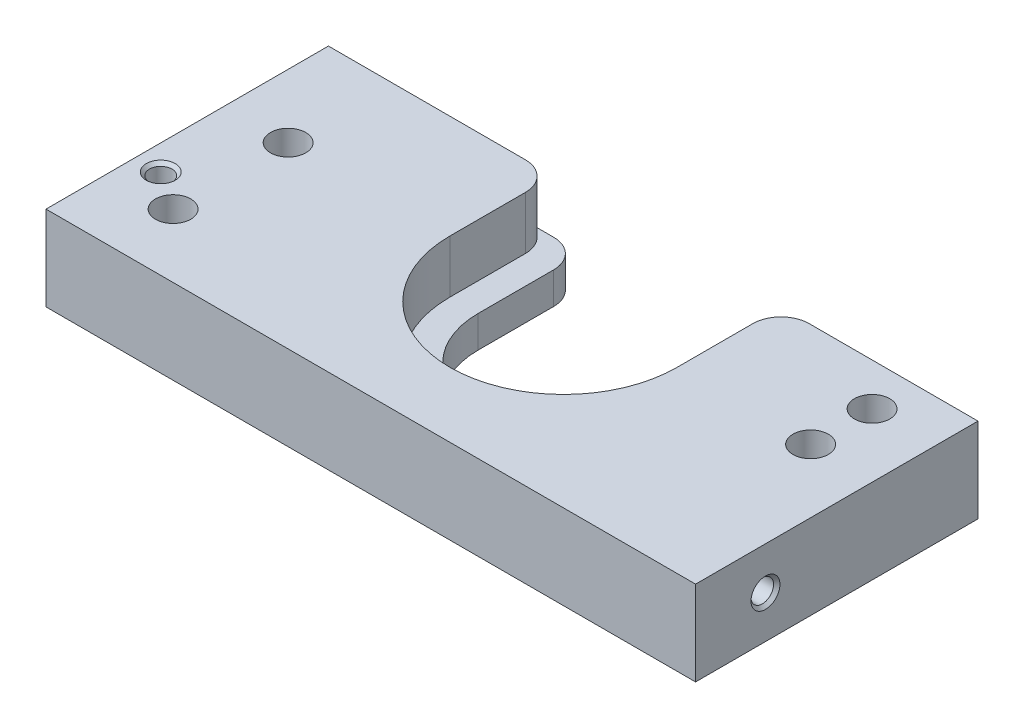
ISO-10303-21;
HEADER;
FILE_DESCRIPTION(('STEP AP214'),'2;1');
FILE_NAME('part.step','',(''),(''),'','','');
FILE_SCHEMA(('AUTOMOTIVE_DESIGN { 1 0 10303 214 1 1 1 1 }'));
ENDSEC;
DATA;
#1=APPLICATION_CONTEXT('core data for automotive mechanical design processes');
#2=APPLICATION_PROTOCOL_DEFINITION('international standard','automotive_design',2000,#1);
#3=PRODUCT_CONTEXT('',#1,'mechanical');
#4=PRODUCT('Part','Part','',(#3));
#5=PRODUCT_RELATED_PRODUCT_CATEGORY('part','',(#4));
#6=PRODUCT_DEFINITION_FORMATION('','',#4);
#7=PRODUCT_DEFINITION_CONTEXT('part definition',#1,'design');
#8=PRODUCT_DEFINITION('design','',#6,#7);
#9=PRODUCT_DEFINITION_SHAPE('','',#8);
#10=(LENGTH_UNIT() NAMED_UNIT(*) SI_UNIT(.MILLI.,.METRE.));
#11=(NAMED_UNIT(*) PLANE_ANGLE_UNIT() SI_UNIT($,.RADIAN.));
#12=(NAMED_UNIT(*) SI_UNIT($,.STERADIAN.) SOLID_ANGLE_UNIT());
#13=UNCERTAINTY_MEASURE_WITH_UNIT(LENGTH_MEASURE(1.E-05),#10,'distance_accuracy_value','');
#14=(GEOMETRIC_REPRESENTATION_CONTEXT(3) GLOBAL_UNCERTAINTY_ASSIGNED_CONTEXT((#13)) GLOBAL_UNIT_ASSIGNED_CONTEXT((#10,
#11,#12)) REPRESENTATION_CONTEXT('',''));
#15=CARTESIAN_POINT('',(0.,0.,0.));
#16=DIRECTION('',(0.,0.,1.));
#17=DIRECTION('',(1.,0.,0.));
#18=AXIS2_PLACEMENT_3D('',#15,#16,#17);
#19=CARTESIAN_POINT('',(8.05,6.,-5.35282576347172));
#20=DIRECTION('',(0.,-1.,0.));
#21=DIRECTION('',(0.,0.,-1.));
#22=AXIS2_PLACEMENT_3D('',#19,#20,#21);
#23=CYLINDRICAL_SURFACE('',#22,2.);
#24=CARTESIAN_POINT('',(8.05,2.25,-5.35282576347172));
#25=DIRECTION('',(0.,1.,0.));
#26=DIRECTION('',(0.,0.,1.));
#27=AXIS2_PLACEMENT_3D('',#24,#25,#26);
#28=CIRCLE('',#27,2.);
#29=CARTESIAN_POINT('',(8.05,2.25,-7.35282576347173));
#30=VERTEX_POINT('',#29);
#31=CARTESIAN_POINT('',(6.05,2.25,-5.35282576347172));
#32=VERTEX_POINT('',#31);
#33=EDGE_CURVE('E273',#30,#32,#28,.T.);
#34=ORIENTED_EDGE('',*,*,#33,.F.);
#35=DIRECTION('',(0.,-1.,0.));
#36=VECTOR('',#35,1.);
#37=CARTESIAN_POINT('',(8.05,6.,-7.35282576347172));
#38=LINE('',#37,#36);
#39=CARTESIAN_POINT('',(8.05,0.,-7.35282576347172));
#40=VERTEX_POINT('',#39);
#41=EDGE_CURVE('E109',#30,#40,#38,.T.);
#42=ORIENTED_EDGE('',*,*,#41,.T.);
#43=CARTESIAN_POINT('',(8.05,0.,-5.35282576347172));
#44=DIRECTION('',(0.,1.,0.));
#45=DIRECTION('',(0.,0.,1.));
#46=AXIS2_PLACEMENT_3D('',#43,#44,#45);
#47=CIRCLE('',#46,2.);
#48=CARTESIAN_POINT('',(6.05,0.,-5.35282576347172));
#49=VERTEX_POINT('',#48);
#50=EDGE_CURVE('E299',#40,#49,#47,.T.);
#51=ORIENTED_EDGE('',*,*,#50,.T.);
#52=DIRECTION('',(0.,-1.,0.));
#53=VECTOR('',#52,1.);
#54=CARTESIAN_POINT('',(6.05,6.,-5.35282576347172));
#55=LINE('',#54,#53);
#56=EDGE_CURVE('E11',#32,#49,#55,.T.);
#57=ORIENTED_EDGE('',*,*,#56,.F.);
#58=EDGE_LOOP('',(#34,#42,#51,#57));
#59=FACE_BOUND('',#58,.T.);
#60=ADVANCED_FACE('F43',(#59),#23,.T.);
#61=CARTESIAN_POINT('',(6.05,6.,-5.35282576347172));
#62=DIRECTION('',(1.,0.,0.));
#63=DIRECTION('',(0.,0.,-1.));
#64=AXIS2_PLACEMENT_3D('',#61,#62,#63);
#65=PLANE('',#64);
#66=DIRECTION('',(0.,0.,1.));
#67=VECTOR('',#66,1.);
#68=CARTESIAN_POINT('',(6.05,2.25,-5.35282576347172));
#69=LINE('',#68,#67);
#70=CARTESIAN_POINT('',(6.05,2.25,0.));
#71=VERTEX_POINT('',#70);
#72=EDGE_CURVE('E271',#32,#71,#69,.T.);
#73=ORIENTED_EDGE('',*,*,#72,.F.);
#74=ORIENTED_EDGE('',*,*,#56,.T.);
#75=DIRECTION('',(0.,0.,1.));
#76=VECTOR('',#75,1.);
#77=CARTESIAN_POINT('',(6.05,0.,-5.35282576347172));
#78=LINE('',#77,#76);
#79=CARTESIAN_POINT('',(6.05,0.,0.));
#80=VERTEX_POINT('',#79);
#81=EDGE_CURVE('E313',#49,#80,#78,.T.);
#82=ORIENTED_EDGE('',*,*,#81,.T.);
#83=DIRECTION('',(0.,-1.,0.));
#84=VECTOR('',#83,1.);
#85=CARTESIAN_POINT('',(6.05,6.,0.));
#86=LINE('',#85,#84);
#87=EDGE_CURVE('E50',#71,#80,#86,.T.);
#88=ORIENTED_EDGE('',*,*,#87,.F.);
#89=EDGE_LOOP('',(#73,#74,#82,#88));
#90=FACE_BOUND('',#89,.T.);
#91=ADVANCED_FACE('F372',(#90),#65,.F.);
#92=CARTESIAN_POINT('',(0.,6.,0.));
#93=DIRECTION('',(0.,-1.,0.));
#94=DIRECTION('',(0.,0.,-1.));
#95=AXIS2_PLACEMENT_3D('',#92,#93,#94);
#96=CYLINDRICAL_SURFACE('',#95,6.05);
#97=CARTESIAN_POINT('',(0.,2.25,0.));
#98=DIRECTION('',(0.,1.,0.));
#99=DIRECTION('',(0.,0.,1.));
#100=AXIS2_PLACEMENT_3D('',#97,#98,#99);
#101=CIRCLE('',#100,6.05);
#102=CARTESIAN_POINT('',(-6.05,2.25,0.));
#103=VERTEX_POINT('',#102);
#104=EDGE_CURVE('E268',#71,#103,#101,.F.);
#105=ORIENTED_EDGE('',*,*,#104,.F.);
#106=ORIENTED_EDGE('',*,*,#87,.T.);
#107=CARTESIAN_POINT('',(0.,0.,0.));
#108=DIRECTION('',(0.,-1.,0.));
#109=DIRECTION('',(0.,0.,-1.));
#110=AXIS2_PLACEMENT_3D('',#107,#108,#109);
#111=CIRCLE('',#110,6.05);
#112=CARTESIAN_POINT('',(-6.05,0.,0.));
#113=VERTEX_POINT('',#112);
#114=EDGE_CURVE('E316',#80,#113,#111,.T.);
#115=ORIENTED_EDGE('',*,*,#114,.T.);
#116=DIRECTION('',(0.,-1.,0.));
#117=VECTOR('',#116,1.);
#118=CARTESIAN_POINT('',(-6.05,6.,0.));
#119=LINE('',#118,#117);
#120=EDGE_CURVE('E360',#103,#113,#119,.T.);
#121=ORIENTED_EDGE('',*,*,#120,.F.);
#122=EDGE_LOOP('',(#105,#106,#115,#121));
#123=FACE_BOUND('',#122,.T.);
#124=ADVANCED_FACE('F365',(#123),#96,.F.);
#125=CARTESIAN_POINT('',(-6.05,6.,0.));
#126=DIRECTION('',(-1.,0.,0.));
#127=DIRECTION('',(0.,0.,1.));
#128=AXIS2_PLACEMENT_3D('',#125,#126,#127);
#129=PLANE('',#128);
#130=DIRECTION('',(0.,0.,-1.));
#131=VECTOR('',#130,1.);
#132=CARTESIAN_POINT('',(-6.05,2.25,0.));
#133=LINE('',#132,#131);
#134=CARTESIAN_POINT('',(-6.05,2.25,-5.35282576347172));
#135=VERTEX_POINT('',#134);
#136=EDGE_CURVE('E265',#103,#135,#133,.T.);
#137=ORIENTED_EDGE('',*,*,#136,.F.);
#138=ORIENTED_EDGE('',*,*,#120,.T.);
#139=DIRECTION('',(0.,0.,-1.));
#140=VECTOR('',#139,1.);
#141=CARTESIAN_POINT('',(-6.05,0.,0.));
#142=LINE('',#141,#140);
#143=CARTESIAN_POINT('',(-6.05,0.,-5.35282576347172));
#144=VERTEX_POINT('',#143);
#145=EDGE_CURVE('E320',#113,#144,#142,.T.);
#146=ORIENTED_EDGE('',*,*,#145,.T.);
#147=DIRECTION('',(0.,-1.,0.));
#148=VECTOR('',#147,1.);
#149=CARTESIAN_POINT('',(-6.05,6.,-5.35282576347172));
#150=LINE('',#149,#148);
#151=EDGE_CURVE('E357',#135,#144,#150,.T.);
#152=ORIENTED_EDGE('',*,*,#151,.F.);
#153=EDGE_LOOP('',(#137,#138,#146,#152));
#154=FACE_BOUND('',#153,.T.);
#155=ADVANCED_FACE('F383',(#154),#129,.F.);
#156=CARTESIAN_POINT('',(-8.05,6.,-5.35282576347172));
#157=DIRECTION('',(0.,-1.,0.));
#158=DIRECTION('',(0.,0.,-1.));
#159=AXIS2_PLACEMENT_3D('',#156,#157,#158);
#160=CYLINDRICAL_SURFACE('',#159,2.);
#161=CARTESIAN_POINT('',(-8.05,2.25,-5.35282576347172));
#162=DIRECTION('',(0.,1.,0.));
#163=DIRECTION('',(0.,0.,1.));
#164=AXIS2_PLACEMENT_3D('',#161,#162,#163);
#165=CIRCLE('',#164,2.);
#166=CARTESIAN_POINT('',(-8.05,2.25,-7.35282576347172));
#167=VERTEX_POINT('',#166);
#168=EDGE_CURVE('E250',#135,#167,#165,.T.);
#169=ORIENTED_EDGE('',*,*,#168,.F.);
#170=ORIENTED_EDGE('',*,*,#151,.T.);
#171=CARTESIAN_POINT('',(-8.05,0.,-5.35282576347172));
#172=DIRECTION('',(0.,1.,0.));
#173=DIRECTION('',(0.,0.,1.));
#174=AXIS2_PLACEMENT_3D('',#171,#172,#173);
#175=CIRCLE('',#174,2.);
#176=CARTESIAN_POINT('',(-8.05,0.,-7.35282576347172));
#177=VERTEX_POINT('',#176);
#178=EDGE_CURVE('E324',#144,#177,#175,.T.);
#179=ORIENTED_EDGE('',*,*,#178,.T.);
#180=DIRECTION('',(0.,-1.,0.));
#181=VECTOR('',#180,1.);
#182=CARTESIAN_POINT('',(-8.05,6.,-7.35282576347172));
#183=LINE('',#182,#181);
#184=EDGE_CURVE('E354',#167,#177,#183,.T.);
#185=ORIENTED_EDGE('',*,*,#184,.F.);
#186=EDGE_LOOP('',(#169,#170,#179,#185));
#187=FACE_BOUND('',#186,.T.);
#188=ADVANCED_FACE('F389',(#187),#160,.T.);
#189=CARTESIAN_POINT('',(8.05,6.,-7.35282576347172));
#190=DIRECTION('',(0.,0.,1.));
#191=DIRECTION('',(1.,0.,0.));
#192=AXIS2_PLACEMENT_3D('',#189,#190,#191);
#193=PLANE('',#192);
#194=DIRECTION('',(0.,1.,0.));
#195=VECTOR('',#194,1.);
#196=CARTESIAN_POINT('',(10.05,2.25,-7.35282576347173));
#197=LINE('',#196,#195);
#198=CARTESIAN_POINT('',(10.05,2.25,-7.35282576347172));
#199=VERTEX_POINT('',#198);
#200=CARTESIAN_POINT('',(10.05,6.,-7.35282576347173));
#201=VERTEX_POINT('',#200);
#202=EDGE_CURVE('E257',#199,#201,#197,.T.);
#203=ORIENTED_EDGE('',*,*,#202,.T.);
#204=DIRECTION('',(-1.,0.,0.));
#205=VECTOR('',#204,1.);
#206=CARTESIAN_POINT('',(8.05,6.,-7.35282576347172));
#207=LINE('',#206,#205);
#208=CARTESIAN_POINT('',(22.0000000002517,6.,-7.35282576347172));
#209=VERTEX_POINT('',#208);
#210=EDGE_CURVE('E310',#209,#201,#207,.T.);
#211=ORIENTED_EDGE('',*,*,#210,.F.);
#212=DIRECTION('',(0.,-1.,0.));
#213=VECTOR('',#212,1.);
#214=CARTESIAN_POINT('',(22.0000000002517,6.,-7.35282576347172));
#215=LINE('',#214,#213);
#216=CARTESIAN_POINT('',(22.0000000002517,0.,-7.35282576347172));
#217=VERTEX_POINT('',#216);
#218=EDGE_CURVE('E341',#209,#217,#215,.T.);
#219=ORIENTED_EDGE('',*,*,#218,.T.);
#220=DIRECTION('',(-1.,0.,0.));
#221=VECTOR('',#220,1.);
#222=CARTESIAN_POINT('',(8.05,0.,-7.35282576347172));
#223=LINE('',#222,#221);
#224=EDGE_CURVE('E304',#217,#40,#223,.T.);
#225=ORIENTED_EDGE('',*,*,#224,.T.);
#226=ORIENTED_EDGE('',*,*,#41,.F.);
#227=DIRECTION('',(-1.,0.,0.));
#228=VECTOR('',#227,1.);
#229=CARTESIAN_POINT('',(-10.05,2.25,-7.35282576347172));
#230=LINE('',#229,#228);
#231=EDGE_CURVE('E222',#199,#30,#230,.T.);
#232=ORIENTED_EDGE('',*,*,#231,.F.);
#233=EDGE_LOOP('',(#203,#211,#219,#225,#226,#232));
#234=FACE_BOUND('',#233,.T.);
#235=ADVANCED_FACE('F415',(#234),#193,.F.);
#236=CARTESIAN_POINT('',(8.05,6.,-5.35282576347172));
#237=DIRECTION('',(0.,1.,0.));
#238=DIRECTION('',(0.,0.,1.));
#239=AXIS2_PLACEMENT_3D('',#236,#237,#238);
#240=PLANE('',#239);
#241=CARTESIAN_POINT('',(-22.2169543155455,6.,6.3042015797983));
#242=DIRECTION('',(0.,1.,0.));
#243=DIRECTION('',(0.,0.,1.));
#244=AXIS2_PLACEMENT_3D('',#241,#242,#243);
#245=CIRCLE('',#244,1.025);
#246=CARTESIAN_POINT('',(-22.2169543155455,6.,7.32920157979829));
#247=VERTEX_POINT('',#246);
#248=EDGE_CURVE('E748',#247,#247,#245,.T.);
#249=ORIENTED_EDGE('',*,*,#248,.F.);
#250=EDGE_LOOP('',(#249));
#251=FACE_BOUND('',#250,.T.);
#252=CARTESIAN_POINT('',(-10.05,6.,-5.35282576347172));
#253=DIRECTION('',(0.,-1.,0.));
#254=DIRECTION('',(0.,0.,1.));
#255=AXIS2_PLACEMENT_3D('',#252,#253,#254);
#256=CIRCLE('',#255,2.);
#257=CARTESIAN_POINT('',(-10.05,6.,-7.35282576347172));
#258=VERTEX_POINT('',#257);
#259=CARTESIAN_POINT('',(-8.05,6.,-5.35282576347172));
#260=VERTEX_POINT('',#259);
#261=EDGE_CURVE('E240',#258,#260,#256,.T.);
#262=ORIENTED_EDGE('',*,*,#261,.F.);
#263=DIRECTION('',(-1.,0.,0.));
#264=VECTOR('',#263,1.);
#265=CARTESIAN_POINT('',(-24.,6.,-7.35282576347172));
#266=LINE('',#265,#264);
#267=CARTESIAN_POINT('',(-24.,6.,-7.35282576347172));
#268=VERTEX_POINT('',#267);
#269=EDGE_CURVE('E116',#258,#268,#266,.T.);
#270=ORIENTED_EDGE('',*,*,#269,.T.);
#271=DIRECTION('',(0.,0.,1.));
#272=VECTOR('',#271,1.);
#273=CARTESIAN_POINT('',(-24.,6.,12.6471742365283));
#274=LINE('',#273,#272);
#275=CARTESIAN_POINT('',(-24.,6.,12.6471742365283));
#276=VERTEX_POINT('',#275);
#277=EDGE_CURVE('E303',#268,#276,#274,.T.);
#278=ORIENTED_EDGE('',*,*,#277,.T.);
#279=DIRECTION('',(1.,0.,0.));
#280=VECTOR('',#279,1.);
#281=CARTESIAN_POINT('',(22.0000000002517,6.,12.6471742365283));
#282=LINE('',#281,#280);
#283=CARTESIAN_POINT('',(22.0000000002517,6.,12.6471742365283));
#284=VERTEX_POINT('',#283);
#285=EDGE_CURVE('E306',#276,#284,#282,.T.);
#286=ORIENTED_EDGE('',*,*,#285,.T.);
#287=DIRECTION('',(0.,0.,-1.));
#288=VECTOR('',#287,1.);
#289=CARTESIAN_POINT('',(22.0000000002517,6.,-7.35282576347172));
#290=LINE('',#289,#288);
#291=EDGE_CURVE('E66',#284,#209,#290,.T.);
#292=ORIENTED_EDGE('',*,*,#291,.T.);
#293=ORIENTED_EDGE('',*,*,#210,.T.);
#294=CARTESIAN_POINT('',(10.05,6.,-5.35282576347173));
#295=DIRECTION('',(0.,-1.,0.));
#296=DIRECTION('',(0.,0.,1.));
#297=AXIS2_PLACEMENT_3D('',#294,#295,#296);
#298=CIRCLE('',#297,2.);
#299=CARTESIAN_POINT('',(8.05,6.,-5.35282576347173));
#300=VERTEX_POINT('',#299);
#301=EDGE_CURVE('E238',#300,#201,#298,.T.);
#302=ORIENTED_EDGE('',*,*,#301,.F.);
#303=DIRECTION('',(0.,0.,-1.));
#304=VECTOR('',#303,1.);
#305=CARTESIAN_POINT('',(8.05,6.,-5.35282576347173));
#306=LINE('',#305,#304);
#307=CARTESIAN_POINT('',(8.05,6.,0.));
#308=VERTEX_POINT('',#307);
#309=EDGE_CURVE('E235',#308,#300,#306,.T.);
#310=ORIENTED_EDGE('',*,*,#309,.F.);
#311=CARTESIAN_POINT('',(0.,6.,0.));
#312=DIRECTION('',(0.,1.,0.));
#313=DIRECTION('',(0.,0.,1.));
#314=AXIS2_PLACEMENT_3D('',#311,#312,#313);
#315=CIRCLE('',#314,8.05);
#316=CARTESIAN_POINT('',(-8.05,6.,0.));
#317=VERTEX_POINT('',#316);
#318=EDGE_CURVE('E212',#317,#308,#315,.T.);
#319=ORIENTED_EDGE('',*,*,#318,.F.);
#320=DIRECTION('',(0.,0.,1.));
#321=VECTOR('',#320,1.);
#322=CARTESIAN_POINT('',(-8.05,6.,0.));
#323=LINE('',#322,#321);
#324=EDGE_CURVE('E218',#260,#317,#323,.T.);
#325=ORIENTED_EDGE('',*,*,#324,.F.);
#326=EDGE_LOOP('',(#262,#270,#278,#286,#292,#293,#302,#310,#319,#325));
#327=FACE_BOUND('',#326,.T.);
#328=CARTESIAN_POINT('',(-19.5,6.,0.));
#329=DIRECTION('',(0.,1.,0.));
#330=DIRECTION('',(0.,0.,1.));
#331=AXIS2_PLACEMENT_3D('',#328,#329,#330);
#332=CIRCLE('',#331,1.25);
#333=CARTESIAN_POINT('',(-19.5,6.,1.25));
#334=VERTEX_POINT('',#333);
#335=EDGE_CURVE('E282',#334,#334,#332,.T.);
#336=ORIENTED_EDGE('',*,*,#335,.F.);
#337=EDGE_LOOP('',(#336));
#338=FACE_BOUND('',#337,.T.);
#339=CARTESIAN_POINT('',(-19.5,6.,8.14717423652828));
#340=DIRECTION('',(0.,1.,0.));
#341=DIRECTION('',(0.,0.,1.));
#342=AXIS2_PLACEMENT_3D('',#339,#340,#341);
#343=CIRCLE('',#342,1.25);
#344=CARTESIAN_POINT('',(-19.5,6.,9.39717423652828));
#345=VERTEX_POINT('',#344);
#346=EDGE_CURVE('E295',#345,#345,#343,.T.);
#347=ORIENTED_EDGE('',*,*,#346,.F.);
#348=EDGE_LOOP('',(#347));
#349=FACE_BOUND('',#348,.T.);
#350=CARTESIAN_POINT('',(17.4999999999658,6.,0.));
#351=DIRECTION('',(0.,1.,0.));
#352=DIRECTION('',(0.,0.,1.));
#353=AXIS2_PLACEMENT_3D('',#350,#351,#352);
#354=CIRCLE('',#353,1.25);
#355=CARTESIAN_POINT('',(17.4999999999658,6.,1.25));
#356=VERTEX_POINT('',#355);
#357=EDGE_CURVE('E289',#356,#356,#354,.T.);
#358=ORIENTED_EDGE('',*,*,#357,.F.);
#359=EDGE_LOOP('',(#358));
#360=FACE_BOUND('',#359,.T.);
#361=CARTESIAN_POINT('',(17.4999999999658,6.,-4.35282576347172));
#362=DIRECTION('',(0.,1.,0.));
#363=DIRECTION('',(0.,0.,1.));
#364=AXIS2_PLACEMENT_3D('',#361,#362,#363);
#365=CIRCLE('',#364,1.25);
#366=CARTESIAN_POINT('',(17.4999999999658,6.,-3.10282576347172));
#367=VERTEX_POINT('',#366);
#368=EDGE_CURVE('E276',#367,#367,#365,.T.);
#369=ORIENTED_EDGE('',*,*,#368,.F.);
#370=EDGE_LOOP('',(#369));
#371=FACE_BOUND('',#370,.T.);
#372=ADVANCED_FACE('F430',(#251,#327,#338,#349,#360,#371),#240,.T.);
#373=CARTESIAN_POINT('',(8.05,0.,-5.35282576347172));
#374=DIRECTION('',(0.,1.,0.));
#375=DIRECTION('',(0.,0.,1.));
#376=AXIS2_PLACEMENT_3D('',#373,#374,#375);
#377=PLANE('',#376);
#378=CARTESIAN_POINT('',(-22.2169543155455,0.,6.3042015797983));
#379=DIRECTION('',(0.,1.,0.));
#380=DIRECTION('',(0.,0.,1.));
#381=AXIS2_PLACEMENT_3D('',#378,#379,#380);
#382=CIRCLE('',#381,0.799999999999999);
#383=CARTESIAN_POINT('',(-22.2169543155455,0.,7.10420157979829));
#384=VERTEX_POINT('',#383);
#385=EDGE_CURVE('E752',#384,#384,#382,.T.);
#386=ORIENTED_EDGE('',*,*,#385,.T.);
#387=EDGE_LOOP('',(#386));
#388=FACE_BOUND('',#387,.T.);
#389=ORIENTED_EDGE('',*,*,#50,.F.);
#390=ORIENTED_EDGE('',*,*,#224,.F.);
#391=DIRECTION('',(0.,0.,-1.));
#392=VECTOR('',#391,1.);
#393=CARTESIAN_POINT('',(22.0000000002517,0.,-7.35282576347172));
#394=LINE('',#393,#392);
#395=CARTESIAN_POINT('',(22.0000000002517,0.,12.6471742365283));
#396=VERTEX_POINT('',#395);
#397=EDGE_CURVE('E337',#396,#217,#394,.T.);
#398=ORIENTED_EDGE('',*,*,#397,.F.);
#399=DIRECTION('',(1.,0.,0.));
#400=VECTOR('',#399,1.);
#401=CARTESIAN_POINT('',(22.0000000002517,0.,12.6471742365283));
#402=LINE('',#401,#400);
#403=CARTESIAN_POINT('',(-24.,0.,12.6471742365283));
#404=VERTEX_POINT('',#403);
#405=EDGE_CURVE('E334',#404,#396,#402,.T.);
#406=ORIENTED_EDGE('',*,*,#405,.F.);
#407=DIRECTION('',(0.,0.,1.));
#408=VECTOR('',#407,1.);
#409=CARTESIAN_POINT('',(-24.,0.,12.6471742365283));
#410=LINE('',#409,#408);
#411=CARTESIAN_POINT('',(-24.,0.,-7.35282576347172));
#412=VERTEX_POINT('',#411);
#413=EDGE_CURVE('E331',#412,#404,#410,.T.);
#414=ORIENTED_EDGE('',*,*,#413,.F.);
#415=DIRECTION('',(-1.,0.,0.));
#416=VECTOR('',#415,1.);
#417=CARTESIAN_POINT('',(-24.,0.,-7.35282576347172));
#418=LINE('',#417,#416);
#419=EDGE_CURVE('E328',#177,#412,#418,.T.);
#420=ORIENTED_EDGE('',*,*,#419,.F.);
#421=ORIENTED_EDGE('',*,*,#178,.F.);
#422=ORIENTED_EDGE('',*,*,#145,.F.);
#423=ORIENTED_EDGE('',*,*,#114,.F.);
#424=ORIENTED_EDGE('',*,*,#81,.F.);
#425=EDGE_LOOP('',(#389,#390,#398,#406,#414,#420,#421,#422,#423,#424));
#426=FACE_BOUND('',#425,.T.);
#427=CARTESIAN_POINT('',(-19.5,0.,8.14717423652828));
#428=DIRECTION('',(0.,1.,0.));
#429=DIRECTION('',(0.,0.,1.));
#430=AXIS2_PLACEMENT_3D('',#427,#428,#429);
#431=CIRCLE('',#430,1.25);
#432=CARTESIAN_POINT('',(-19.5,0.,9.39717423652828));
#433=VERTEX_POINT('',#432);
#434=EDGE_CURVE('E292',#433,#433,#431,.T.);
#435=ORIENTED_EDGE('',*,*,#434,.T.);
#436=EDGE_LOOP('',(#435));
#437=FACE_BOUND('',#436,.T.);
#438=CARTESIAN_POINT('',(17.4999999999658,0.,0.));
#439=DIRECTION('',(0.,1.,0.));
#440=DIRECTION('',(0.,0.,1.));
#441=AXIS2_PLACEMENT_3D('',#438,#439,#440);
#442=CIRCLE('',#441,1.25);
#443=CARTESIAN_POINT('',(17.4999999999658,0.,1.25));
#444=VERTEX_POINT('',#443);
#445=EDGE_CURVE('E285',#444,#444,#442,.T.);
#446=ORIENTED_EDGE('',*,*,#445,.T.);
#447=EDGE_LOOP('',(#446));
#448=FACE_BOUND('',#447,.T.);
#449=CARTESIAN_POINT('',(-19.5,0.,0.));
#450=DIRECTION('',(0.,1.,0.));
#451=DIRECTION('',(0.,0.,1.));
#452=AXIS2_PLACEMENT_3D('',#449,#450,#451);
#453=CIRCLE('',#452,1.25);
#454=CARTESIAN_POINT('',(-19.5,0.,1.25));
#455=VERTEX_POINT('',#454);
#456=EDGE_CURVE('E279',#455,#455,#453,.T.);
#457=ORIENTED_EDGE('',*,*,#456,.T.);
#458=EDGE_LOOP('',(#457));
#459=FACE_BOUND('',#458,.T.);
#460=CARTESIAN_POINT('',(17.4999999999658,0.,-4.35282576347172));
#461=DIRECTION('',(0.,1.,0.));
#462=DIRECTION('',(0.,0.,1.));
#463=AXIS2_PLACEMENT_3D('',#460,#461,#462);
#464=CIRCLE('',#463,1.25);
#465=CARTESIAN_POINT('',(17.4999999999658,0.,-3.10282576347172));
#466=VERTEX_POINT('',#465);
#467=EDGE_CURVE('E275',#466,#466,#464,.T.);
#468=ORIENTED_EDGE('',*,*,#467,.T.);
#469=EDGE_LOOP('',(#468));
#470=FACE_BOUND('',#469,.T.);
#471=ADVANCED_FACE('F376',(#388,#426,#437,#448,#459,#470),#377,.F.);
#472=CARTESIAN_POINT('',(-24.,6.,-7.35282576347172));
#473=DIRECTION('',(0.,0.,1.));
#474=DIRECTION('',(1.,0.,0.));
#475=AXIS2_PLACEMENT_3D('',#472,#473,#474);
#476=PLANE('',#475);
#477=ORIENTED_EDGE('',*,*,#269,.F.);
#478=DIRECTION('',(0.,1.,0.));
#479=VECTOR('',#478,1.);
#480=CARTESIAN_POINT('',(-10.05,2.25,-7.35282576347172));
#481=LINE('',#480,#479);
#482=CARTESIAN_POINT('',(-10.05,2.25,-7.35282576347172));
#483=VERTEX_POINT('',#482);
#484=EDGE_CURVE('E254',#483,#258,#481,.T.);
#485=ORIENTED_EDGE('',*,*,#484,.F.);
#486=EDGE_CURVE('E221',#167,#483,#230,.T.);
#487=ORIENTED_EDGE('',*,*,#486,.F.);
#488=ORIENTED_EDGE('',*,*,#184,.T.);
#489=ORIENTED_EDGE('',*,*,#419,.T.);
#490=DIRECTION('',(0.,-1.,0.));
#491=VECTOR('',#490,1.);
#492=CARTESIAN_POINT('',(-24.,6.,-7.35282576347172));
#493=LINE('',#492,#491);
#494=EDGE_CURVE('E350',#268,#412,#493,.T.);
#495=ORIENTED_EDGE('',*,*,#494,.F.);
#496=EDGE_LOOP('',(#477,#485,#487,#488,#489,#495));
#497=FACE_BOUND('',#496,.T.);
#498=ADVANCED_FACE('F391',(#497),#476,.F.);
#499=CARTESIAN_POINT('',(-24.,6.,12.6471742365283));
#500=DIRECTION('',(1.,0.,0.));
#501=DIRECTION('',(0.,0.,-1.));
#502=AXIS2_PLACEMENT_3D('',#499,#500,#501);
#503=PLANE('',#502);
#504=CARTESIAN_POINT('',(-24.,3.,10.5471742365283));
#505=DIRECTION('',(-1.,0.,0.));
#506=DIRECTION('',(0.,0.,1.));
#507=AXIS2_PLACEMENT_3D('',#504,#505,#506);
#508=CIRCLE('',#507,1.025);
#509=CARTESIAN_POINT('',(-24.,3.,11.5721742365283));
#510=VERTEX_POINT('',#509);
#511=EDGE_CURVE('E203',#510,#510,#508,.T.);
#512=ORIENTED_EDGE('',*,*,#511,.F.);
#513=EDGE_LOOP('',(#512));
#514=FACE_BOUND('',#513,.T.);
#515=ORIENTED_EDGE('',*,*,#413,.T.);
#516=DIRECTION('',(0.,-1.,0.));
#517=VECTOR('',#516,1.);
#518=CARTESIAN_POINT('',(-24.,6.,12.6471742365283));
#519=LINE('',#518,#517);
#520=EDGE_CURVE('E347',#276,#404,#519,.T.);
#521=ORIENTED_EDGE('',*,*,#520,.F.);
#522=ORIENTED_EDGE('',*,*,#277,.F.);
#523=ORIENTED_EDGE('',*,*,#494,.T.);
#524=EDGE_LOOP('',(#515,#521,#522,#523));
#525=FACE_BOUND('',#524,.T.);
#526=ADVANCED_FACE('F428',(#514,#525),#503,.F.);
#527=CARTESIAN_POINT('',(22.0000000002517,6.,12.6471742365283));
#528=DIRECTION('',(0.,0.,-1.));
#529=DIRECTION('',(-1.,0.,0.));
#530=AXIS2_PLACEMENT_3D('',#527,#528,#529);
#531=PLANE('',#530);
#532=ORIENTED_EDGE('',*,*,#405,.T.);
#533=DIRECTION('',(0.,-1.,0.));
#534=VECTOR('',#533,1.);
#535=CARTESIAN_POINT('',(22.0000000002517,6.,12.6471742365283));
#536=LINE('',#535,#534);
#537=EDGE_CURVE('E344',#284,#396,#536,.T.);
#538=ORIENTED_EDGE('',*,*,#537,.F.);
#539=ORIENTED_EDGE('',*,*,#285,.F.);
#540=ORIENTED_EDGE('',*,*,#520,.T.);
#541=EDGE_LOOP('',(#532,#538,#539,#540));
#542=FACE_BOUND('',#541,.T.);
#543=ADVANCED_FACE('F424',(#542),#531,.F.);
#544=CARTESIAN_POINT('',(22.0000000002517,6.,-7.35282576347172));
#545=DIRECTION('',(-1.,0.,0.));
#546=DIRECTION('',(0.,0.,1.));
#547=AXIS2_PLACEMENT_3D('',#544,#545,#546);
#548=PLANE('',#547);
#549=CARTESIAN_POINT('',(22.0000000002517,3.,7.69717423652827));
#550=DIRECTION('',(1.,0.,0.));
#551=DIRECTION('',(0.,0.,-1.));
#552=AXIS2_PLACEMENT_3D('',#549,#550,#551);
#553=CIRCLE('',#552,1.025);
#554=CARTESIAN_POINT('',(22.0000000002517,3.,6.67217423652827));
#555=VERTEX_POINT('',#554);
#556=EDGE_CURVE('E194',#555,#555,#553,.T.);
#557=ORIENTED_EDGE('',*,*,#556,.F.);
#558=EDGE_LOOP('',(#557));
#559=FACE_BOUND('',#558,.T.);
#560=ORIENTED_EDGE('',*,*,#397,.T.);
#561=ORIENTED_EDGE('',*,*,#218,.F.);
#562=ORIENTED_EDGE('',*,*,#291,.F.);
#563=ORIENTED_EDGE('',*,*,#537,.T.);
#564=EDGE_LOOP('',(#560,#561,#562,#563));
#565=FACE_BOUND('',#564,.T.);
#566=ADVANCED_FACE('F420',(#559,#565),#548,.F.);
#567=CARTESIAN_POINT('',(-19.5,6.,8.14717423652828));
#568=DIRECTION('',(0.,-1.,0.));
#569=DIRECTION('',(0.,0.,-1.));
#570=AXIS2_PLACEMENT_3D('',#567,#568,#569);
#571=CYLINDRICAL_SURFACE('',#570,1.25);
#572=ORIENTED_EDGE('',*,*,#346,.T.);
#573=EDGE_LOOP('',(#572));
#574=FACE_BOUND('',#573,.T.);
#575=ORIENTED_EDGE('',*,*,#434,.F.);
#576=EDGE_LOOP('',(#575));
#577=FACE_BOUND('',#576,.T.);
#578=ADVANCED_FACE('F478',(#574,#577),#571,.F.);
#579=CARTESIAN_POINT('',(17.4999999999658,6.,0.));
#580=DIRECTION('',(0.,-1.,0.));
#581=DIRECTION('',(0.,0.,-1.));
#582=AXIS2_PLACEMENT_3D('',#579,#580,#581);
#583=CYLINDRICAL_SURFACE('',#582,1.25);
#584=ORIENTED_EDGE('',*,*,#357,.T.);
#585=EDGE_LOOP('',(#584));
#586=FACE_BOUND('',#585,.T.);
#587=ORIENTED_EDGE('',*,*,#445,.F.);
#588=EDGE_LOOP('',(#587));
#589=FACE_BOUND('',#588,.T.);
#590=ADVANCED_FACE('F651',(#586,#589),#583,.F.);
#591=CARTESIAN_POINT('',(-19.5,6.,0.));
#592=DIRECTION('',(0.,-1.,0.));
#593=DIRECTION('',(0.,0.,-1.));
#594=AXIS2_PLACEMENT_3D('',#591,#592,#593);
#595=CYLINDRICAL_SURFACE('',#594,1.25);
#596=ORIENTED_EDGE('',*,*,#335,.T.);
#597=EDGE_LOOP('',(#596));
#598=FACE_BOUND('',#597,.T.);
#599=ORIENTED_EDGE('',*,*,#456,.F.);
#600=EDGE_LOOP('',(#599));
#601=FACE_BOUND('',#600,.T.);
#602=ADVANCED_FACE('F446',(#598,#601),#595,.F.);
#603=CARTESIAN_POINT('',(17.4999999999658,6.,-4.35282576347172));
#604=DIRECTION('',(0.,-1.,0.));
#605=DIRECTION('',(0.,0.,-1.));
#606=AXIS2_PLACEMENT_3D('',#603,#604,#605);
#607=CYLINDRICAL_SURFACE('',#606,1.25);
#608=ORIENTED_EDGE('',*,*,#368,.T.);
#609=EDGE_LOOP('',(#608));
#610=FACE_BOUND('',#609,.T.);
#611=ORIENTED_EDGE('',*,*,#467,.F.);
#612=EDGE_LOOP('',(#611));
#613=FACE_BOUND('',#612,.T.);
#614=ADVANCED_FACE('F443',(#610,#613),#607,.F.);
#615=CARTESIAN_POINT('',(0.,2.25,0.));
#616=DIRECTION('',(0.,1.,0.));
#617=DIRECTION('',(0.,0.,1.));
#618=AXIS2_PLACEMENT_3D('',#615,#616,#617);
#619=PLANE('',#618);
#620=ORIENTED_EDGE('',*,*,#33,.T.);
#621=ORIENTED_EDGE('',*,*,#72,.T.);
#622=ORIENTED_EDGE('',*,*,#104,.T.);
#623=ORIENTED_EDGE('',*,*,#136,.T.);
#624=ORIENTED_EDGE('',*,*,#168,.T.);
#625=ORIENTED_EDGE('',*,*,#486,.T.);
#626=CARTESIAN_POINT('',(-10.05,2.25,-5.35282576347172));
#627=DIRECTION('',(0.,-1.,0.));
#628=DIRECTION('',(0.,0.,1.));
#629=AXIS2_PLACEMENT_3D('',#626,#627,#628);
#630=CIRCLE('',#629,2.);
#631=CARTESIAN_POINT('',(-8.05,2.25,-5.35282576347172));
#632=VERTEX_POINT('',#631);
#633=EDGE_CURVE('E224',#483,#632,#630,.T.);
#634=ORIENTED_EDGE('',*,*,#633,.T.);
#635=DIRECTION('',(0.,0.,1.));
#636=VECTOR('',#635,1.);
#637=CARTESIAN_POINT('',(-8.05,2.25,0.));
#638=LINE('',#637,#636);
#639=CARTESIAN_POINT('',(-8.05,2.25,0.));
#640=VERTEX_POINT('',#639);
#641=EDGE_CURVE('E228',#632,#640,#638,.T.);
#642=ORIENTED_EDGE('',*,*,#641,.T.);
#643=CARTESIAN_POINT('',(0.,2.25,0.));
#644=DIRECTION('',(0.,1.,0.));
#645=DIRECTION('',(0.,0.,1.));
#646=AXIS2_PLACEMENT_3D('',#643,#644,#645);
#647=CIRCLE('',#646,8.05);
#648=CARTESIAN_POINT('',(8.05,2.25,0.));
#649=VERTEX_POINT('',#648);
#650=EDGE_CURVE('E213',#640,#649,#647,.T.);
#651=ORIENTED_EDGE('',*,*,#650,.T.);
#652=DIRECTION('',(0.,0.,-1.));
#653=VECTOR('',#652,1.);
#654=CARTESIAN_POINT('',(8.05,2.25,-5.35282576347173));
#655=LINE('',#654,#653);
#656=CARTESIAN_POINT('',(8.05,2.25,-5.35282576347173));
#657=VERTEX_POINT('',#656);
#658=EDGE_CURVE('E217',#649,#657,#655,.T.);
#659=ORIENTED_EDGE('',*,*,#658,.T.);
#660=CARTESIAN_POINT('',(10.05,2.25,-5.35282576347173));
#661=DIRECTION('',(0.,-1.,0.));
#662=DIRECTION('',(0.,0.,1.));
#663=AXIS2_PLACEMENT_3D('',#660,#661,#662);
#664=CIRCLE('',#663,2.);
#665=EDGE_CURVE('E57',#657,#199,#664,.T.);
#666=ORIENTED_EDGE('',*,*,#665,.T.);
#667=ORIENTED_EDGE('',*,*,#231,.T.);
#668=EDGE_LOOP('',(#620,#621,#622,#623,#624,#625,#634,#642,#651,#659,#666,#667));
#669=FACE_BOUND('',#668,.T.);
#670=ADVANCED_FACE('F385',(#669),#619,.T.);
#671=CARTESIAN_POINT('',(0.,2.25,0.));
#672=DIRECTION('',(0.,1.,0.));
#673=DIRECTION('',(0.,0.,1.));
#674=AXIS2_PLACEMENT_3D('',#671,#672,#673);
#675=CYLINDRICAL_SURFACE('',#674,8.05);
#676=ORIENTED_EDGE('',*,*,#318,.T.);
#677=DIRECTION('',(0.,1.,0.));
#678=VECTOR('',#677,1.);
#679=CARTESIAN_POINT('',(8.05,2.25,0.));
#680=LINE('',#679,#678);
#681=EDGE_CURVE('E232',#649,#308,#680,.T.);
#682=ORIENTED_EDGE('',*,*,#681,.F.);
#683=ORIENTED_EDGE('',*,*,#650,.F.);
#684=DIRECTION('',(0.,1.,0.));
#685=VECTOR('',#684,1.);
#686=CARTESIAN_POINT('',(-8.05,2.25,0.));
#687=LINE('',#686,#685);
#688=EDGE_CURVE('E247',#640,#317,#687,.T.);
#689=ORIENTED_EDGE('',*,*,#688,.T.);
#690=EDGE_LOOP('',(#676,#682,#683,#689));
#691=FACE_BOUND('',#690,.T.);
#692=ADVANCED_FACE('F405',(#691),#675,.F.);
#693=CARTESIAN_POINT('',(-8.05,2.25,0.));
#694=DIRECTION('',(-1.,0.,0.));
#695=DIRECTION('',(0.,0.,1.));
#696=AXIS2_PLACEMENT_3D('',#693,#694,#695);
#697=PLANE('',#696);
#698=ORIENTED_EDGE('',*,*,#324,.T.);
#699=ORIENTED_EDGE('',*,*,#688,.F.);
#700=ORIENTED_EDGE('',*,*,#641,.F.);
#701=DIRECTION('',(0.,1.,0.));
#702=VECTOR('',#701,1.);
#703=CARTESIAN_POINT('',(-8.05,2.25,-5.35282576347172));
#704=LINE('',#703,#702);
#705=EDGE_CURVE('E251',#632,#260,#704,.T.);
#706=ORIENTED_EDGE('',*,*,#705,.T.);
#707=EDGE_LOOP('',(#698,#699,#700,#706));
#708=FACE_BOUND('',#707,.T.);
#709=ADVANCED_FACE('F400',(#708),#697,.F.);
#710=CARTESIAN_POINT('',(-10.05,2.25,-5.35282576347172));
#711=DIRECTION('',(0.,1.,0.));
#712=DIRECTION('',(0.,0.,1.));
#713=AXIS2_PLACEMENT_3D('',#710,#711,#712);
#714=CYLINDRICAL_SURFACE('',#713,2.);
#715=ORIENTED_EDGE('',*,*,#261,.T.);
#716=ORIENTED_EDGE('',*,*,#705,.F.);
#717=ORIENTED_EDGE('',*,*,#633,.F.);
#718=ORIENTED_EDGE('',*,*,#484,.T.);
#719=EDGE_LOOP('',(#715,#716,#717,#718));
#720=FACE_BOUND('',#719,.T.);
#721=ADVANCED_FACE('F397',(#720),#714,.T.);
#722=CARTESIAN_POINT('',(10.05,2.25,-5.35282576347173));
#723=DIRECTION('',(0.,1.,0.));
#724=DIRECTION('',(0.,0.,1.));
#725=AXIS2_PLACEMENT_3D('',#722,#723,#724);
#726=CYLINDRICAL_SURFACE('',#725,2.);
#727=ORIENTED_EDGE('',*,*,#301,.T.);
#728=ORIENTED_EDGE('',*,*,#202,.F.);
#729=ORIENTED_EDGE('',*,*,#665,.F.);
#730=DIRECTION('',(0.,1.,0.));
#731=VECTOR('',#730,1.);
#732=CARTESIAN_POINT('',(8.05,2.25,-5.35282576347173));
#733=LINE('',#732,#731);
#734=EDGE_CURVE('E260',#657,#300,#733,.T.);
#735=ORIENTED_EDGE('',*,*,#734,.T.);
#736=EDGE_LOOP('',(#727,#728,#729,#735));
#737=FACE_BOUND('',#736,.T.);
#738=ADVANCED_FACE('F411',(#737),#726,.T.);
#739=CARTESIAN_POINT('',(8.05,2.25,-5.35282576347173));
#740=DIRECTION('',(1.,0.,0.));
#741=DIRECTION('',(0.,0.,-1.));
#742=AXIS2_PLACEMENT_3D('',#739,#740,#741);
#743=PLANE('',#742);
#744=ORIENTED_EDGE('',*,*,#309,.T.);
#745=ORIENTED_EDGE('',*,*,#734,.F.);
#746=ORIENTED_EDGE('',*,*,#658,.F.);
#747=ORIENTED_EDGE('',*,*,#681,.T.);
#748=EDGE_LOOP('',(#744,#745,#746,#747));
#749=FACE_BOUND('',#748,.T.);
#750=ADVANCED_FACE('F408',(#749),#743,.F.);
#751=CARTESIAN_POINT('',(14.0000000002517,3.,7.69717423652827));
#752=DIRECTION('',(1.,0.,0.));
#753=DIRECTION('',(0.,0.,-1.));
#754=AXIS2_PLACEMENT_3D('',#751,#752,#753);
#755=CONICAL_SURFACE('',#754,0.799999999999998,1.02974425867665);
#756=CARTESIAN_POINT('',(13.5193115050297,3.,7.69717423652827));
#757=VERTEX_POINT('',#756);
#758=VERTEX_LOOP('',#757);
#759=FACE_BOUND('',#758,.T.);
#760=CARTESIAN_POINT('',(14.0000000002517,3.,7.69717423652827));
#761=DIRECTION('',(1.,0.,0.));
#762=DIRECTION('',(0.,0.,-1.));
#763=AXIS2_PLACEMENT_3D('',#760,#761,#762);
#764=CIRCLE('',#763,0.799999999999998);
#765=CARTESIAN_POINT('',(14.0000000002517,3.,6.89717423652827));
#766=VERTEX_POINT('',#765);
#767=EDGE_CURVE('E209',#766,#766,#764,.T.);
#768=ORIENTED_EDGE('',*,*,#767,.T.);
#769=EDGE_LOOP('',(#768));
#770=FACE_BOUND('',#769,.T.);
#771=ADVANCED_FACE('F548',(#759,#770),#755,.F.);
#772=CARTESIAN_POINT('',(22.0000000002517,3.,7.69717423652827));
#773=DIRECTION('',(1.,0.,0.));
#774=DIRECTION('',(0.,0.,-1.));
#775=AXIS2_PLACEMENT_3D('',#772,#773,#774);
#776=CYLINDRICAL_SURFACE('',#775,0.799999999999999);
#777=ORIENTED_EDGE('',*,*,#767,.F.);
#778=EDGE_LOOP('',(#777));
#779=FACE_BOUND('',#778,.T.);
#780=CARTESIAN_POINT('',(21.7750000002517,3.,7.69717423652827));
#781=DIRECTION('',(1.,0.,0.));
#782=DIRECTION('',(0.,0.,-1.));
#783=AXIS2_PLACEMENT_3D('',#780,#781,#782);
#784=CIRCLE('',#783,0.799999999999999);
#785=CARTESIAN_POINT('',(21.7750000002517,3.,6.89717423652827));
#786=VERTEX_POINT('',#785);
#787=EDGE_CURVE('E200',#786,#786,#784,.T.);
#788=ORIENTED_EDGE('',*,*,#787,.T.);
#789=EDGE_LOOP('',(#788));
#790=FACE_BOUND('',#789,.T.);
#791=ADVANCED_FACE('F557',(#779,#790),#776,.F.);
#792=CARTESIAN_POINT('',(22.0000000002517,3.,7.69717423652827));
#793=DIRECTION('',(1.,0.,0.));
#794=DIRECTION('',(0.,0.,-1.));
#795=AXIS2_PLACEMENT_3D('',#792,#793,#794);
#796=CONICAL_SURFACE('',#795,1.025,0.78539816339745);
#797=ORIENTED_EDGE('',*,*,#787,.F.);
#798=EDGE_LOOP('',(#797));
#799=FACE_BOUND('',#798,.T.);
#800=ORIENTED_EDGE('',*,*,#556,.T.);
#801=EDGE_LOOP('',(#800));
#802=FACE_BOUND('',#801,.T.);
#803=ADVANCED_FACE('F187',(#799,#802),#796,.F.);
#804=CARTESIAN_POINT('',(-16.,3.,10.5471742365283));
#805=DIRECTION('',(-1.,0.,0.));
#806=DIRECTION('',(0.,0.,1.));
#807=AXIS2_PLACEMENT_3D('',#804,#805,#806);
#808=CONICAL_SURFACE('',#807,0.799999999999988,1.02974425867664);
#809=CARTESIAN_POINT('',(-15.519311504778,3.,10.5471742365283));
#810=VERTEX_POINT('',#809);
#811=VERTEX_LOOP('',#810);
#812=FACE_BOUND('',#811,.T.);
#813=CARTESIAN_POINT('',(-16.,3.,10.5471742365283));
#814=DIRECTION('',(-1.,0.,0.));
#815=DIRECTION('',(0.,0.,1.));
#816=AXIS2_PLACEMENT_3D('',#813,#814,#815);
#817=CIRCLE('',#816,0.799999999999988);
#818=CARTESIAN_POINT('',(-16.,3.,11.3471742365283));
#819=VERTEX_POINT('',#818);
#820=EDGE_CURVE('E191',#819,#819,#817,.T.);
#821=ORIENTED_EDGE('',*,*,#820,.T.);
#822=EDGE_LOOP('',(#821));
#823=FACE_BOUND('',#822,.T.);
#824=ADVANCED_FACE('F183',(#812,#823),#808,.F.);
#825=CARTESIAN_POINT('',(-24.,3.,10.5471742365283));
#826=DIRECTION('',(-1.,0.,0.));
#827=DIRECTION('',(0.,0.,1.));
#828=AXIS2_PLACEMENT_3D('',#825,#826,#827);
#829=CYLINDRICAL_SURFACE('',#828,0.799999999999989);
#830=ORIENTED_EDGE('',*,*,#820,.F.);
#831=EDGE_LOOP('',(#830));
#832=FACE_BOUND('',#831,.T.);
#833=CARTESIAN_POINT('',(-23.775,3.,10.5471742365283));
#834=DIRECTION('',(-1.,0.,0.));
#835=DIRECTION('',(0.,0.,1.));
#836=AXIS2_PLACEMENT_3D('',#833,#834,#835);
#837=CIRCLE('',#836,0.79999999999999);
#838=CARTESIAN_POINT('',(-23.775,3.,11.3471742365283));
#839=VERTEX_POINT('',#838);
#840=EDGE_CURVE('E195',#839,#839,#837,.T.);
#841=ORIENTED_EDGE('',*,*,#840,.T.);
#842=EDGE_LOOP('',(#841));
#843=FACE_BOUND('',#842,.T.);
#844=ADVANCED_FACE('F186',(#832,#843),#829,.F.);
#845=CARTESIAN_POINT('',(-24.,3.,10.5471742365283));
#846=DIRECTION('',(-1.,0.,0.));
#847=DIRECTION('',(0.,0.,1.));
#848=AXIS2_PLACEMENT_3D('',#845,#846,#847);
#849=CONICAL_SURFACE('',#848,1.025,0.785398163397464);
#850=ORIENTED_EDGE('',*,*,#840,.F.);
#851=EDGE_LOOP('',(#850));
#852=FACE_BOUND('',#851,.T.);
#853=ORIENTED_EDGE('',*,*,#511,.T.);
#854=EDGE_LOOP('',(#853));
#855=FACE_BOUND('',#854,.T.);
#856=ADVANCED_FACE('F589',(#852,#855),#849,.F.);
#857=CARTESIAN_POINT('',(-22.2169543155455,6.,6.3042015797983));
#858=DIRECTION('',(0.,1.,0.));
#859=DIRECTION('',(0.,0.,1.));
#860=AXIS2_PLACEMENT_3D('',#857,#858,#859);
#861=CYLINDRICAL_SURFACE('',#860,0.799999999999999);
#862=ORIENTED_EDGE('',*,*,#385,.F.);
#863=EDGE_LOOP('',(#862));
#864=FACE_BOUND('',#863,.T.);
#865=CARTESIAN_POINT('',(-22.2169543155455,5.775,6.3042015797983));
#866=DIRECTION('',(0.,1.,0.));
#867=DIRECTION('',(0.,0.,1.));
#868=AXIS2_PLACEMENT_3D('',#865,#866,#867);
#869=CIRCLE('',#868,0.799999999999999);
#870=CARTESIAN_POINT('',(-22.2169543155455,5.775,7.10420157979829));
#871=VERTEX_POINT('',#870);
#872=EDGE_CURVE('E745',#871,#871,#869,.T.);
#873=ORIENTED_EDGE('',*,*,#872,.T.);
#874=EDGE_LOOP('',(#873));
#875=FACE_BOUND('',#874,.T.);
#876=ADVANCED_FACE('F597',(#864,#875),#861,.F.);
#877=CARTESIAN_POINT('',(-22.2169543155455,6.,6.3042015797983));
#878=DIRECTION('',(0.,1.,0.));
#879=DIRECTION('',(0.,0.,1.));
#880=AXIS2_PLACEMENT_3D('',#877,#878,#879);
#881=CONICAL_SURFACE('',#880,1.025,0.785398163397445);
#882=ORIENTED_EDGE('',*,*,#872,.F.);
#883=EDGE_LOOP('',(#882));
#884=FACE_BOUND('',#883,.T.);
#885=ORIENTED_EDGE('',*,*,#248,.T.);
#886=EDGE_LOOP('',(#885));
#887=FACE_BOUND('',#886,.T.);
#888=ADVANCED_FACE('F605',(#884,#887),#881,.F.);
#889=CLOSED_SHELL('',(#60,#91,#124,#155,#188,#235,#372,#471,#498,#526,#543,#566,#578,#590,#602,
#614,#670,#692,#709,#721,#738,#750,#771,#791,#803,#824,#844,#856,#876,#888));
#890=MANIFOLD_SOLID_BREP('B2',#889);
#891=ADVANCED_BREP_SHAPE_REPRESENTATION('',(#18,#890),#14);
#892=SHAPE_DEFINITION_REPRESENTATION(#9,#891);
ENDSEC;
END-ISO-10303-21;
